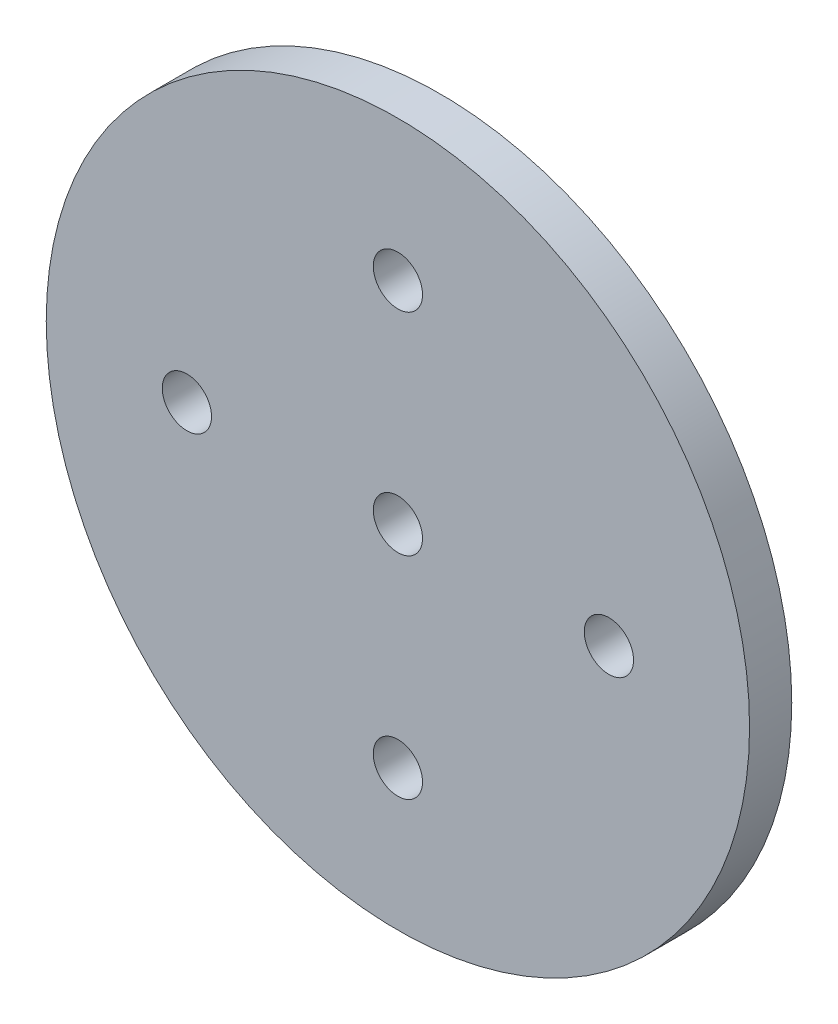
ISO-10303-21;
HEADER;
FILE_DESCRIPTION(('STEP AP214'),'2;1');
FILE_NAME('part.step','',(''),(''),'','','');
FILE_SCHEMA(('AUTOMOTIVE_DESIGN { 1 0 10303 214 1 1 1 1 }'));
ENDSEC;
DATA;
#1=APPLICATION_CONTEXT('core data for automotive mechanical design processes');
#2=APPLICATION_PROTOCOL_DEFINITION('international standard','automotive_design',2000,#1);
#3=PRODUCT_CONTEXT('',#1,'mechanical');
#4=PRODUCT('Part','Part','',(#3));
#5=PRODUCT_RELATED_PRODUCT_CATEGORY('part','',(#4));
#6=PRODUCT_DEFINITION_FORMATION('','',#4);
#7=PRODUCT_DEFINITION_CONTEXT('part definition',#1,'design');
#8=PRODUCT_DEFINITION('design','',#6,#7);
#9=PRODUCT_DEFINITION_SHAPE('','',#8);
#10=(LENGTH_UNIT() NAMED_UNIT(*) SI_UNIT(.MILLI.,.METRE.));
#11=(NAMED_UNIT(*) PLANE_ANGLE_UNIT() SI_UNIT($,.RADIAN.));
#12=(NAMED_UNIT(*) SI_UNIT($,.STERADIAN.) SOLID_ANGLE_UNIT());
#13=UNCERTAINTY_MEASURE_WITH_UNIT(LENGTH_MEASURE(1.E-05),#10,'distance_accuracy_value','');
#14=(GEOMETRIC_REPRESENTATION_CONTEXT(3) GLOBAL_UNCERTAINTY_ASSIGNED_CONTEXT((#13)) GLOBAL_UNIT_ASSIGNED_CONTEXT((#10,
#11,#12)) REPRESENTATION_CONTEXT('',''));
#15=CARTESIAN_POINT('',(0.,0.,0.));
#16=DIRECTION('',(0.,0.,1.));
#17=DIRECTION('',(1.,0.,0.));
#18=AXIS2_PLACEMENT_3D('',#15,#16,#17);
#19=CARTESIAN_POINT('',(0.,0.,3.));
#20=DIRECTION('',(0.,0.,1.));
#21=DIRECTION('',(1.,0.,0.));
#22=AXIS2_PLACEMENT_3D('',#19,#20,#21);
#23=PLANE('',#22);
#24=CARTESIAN_POINT('',(0.,-15.,3.));
#25=DIRECTION('',(0.,0.,1.));
#26=DIRECTION('',(1.,0.,0.));
#27=AXIS2_PLACEMENT_3D('',#24,#25,#26);
#28=CIRCLE('',#27,1.75);
#29=CARTESIAN_POINT('',(1.75,-15.,3.));
#30=VERTEX_POINT('',#29);
#31=EDGE_CURVE('E57',#30,#30,#28,.T.);
#32=ORIENTED_EDGE('',*,*,#31,.F.);
#33=EDGE_LOOP('',(#32));
#34=FACE_BOUND('',#33,.T.);
#35=CARTESIAN_POINT('',(0.,15.,3.));
#36=DIRECTION('',(0.,0.,1.));
#37=DIRECTION('',(1.,0.,0.));
#38=AXIS2_PLACEMENT_3D('',#35,#36,#37);
#39=CIRCLE('',#38,1.75);
#40=CARTESIAN_POINT('',(1.75,15.,3.));
#41=VERTEX_POINT('',#40);
#42=EDGE_CURVE('E45',#41,#41,#39,.T.);
#43=ORIENTED_EDGE('',*,*,#42,.F.);
#44=EDGE_LOOP('',(#43));
#45=FACE_BOUND('',#44,.T.);
#46=CARTESIAN_POINT('',(0.,0.,3.));
#47=DIRECTION('',(0.,0.,1.));
#48=DIRECTION('',(1.,0.,0.));
#49=AXIS2_PLACEMENT_3D('',#46,#47,#48);
#50=CIRCLE('',#49,25.);
#51=CARTESIAN_POINT('',(25.,0.,3.));
#52=VERTEX_POINT('',#51);
#53=EDGE_CURVE('E10',#52,#52,#50,.T.);
#54=ORIENTED_EDGE('',*,*,#53,.T.);
#55=EDGE_LOOP('',(#54));
#56=FACE_BOUND('',#55,.T.);
#57=CARTESIAN_POINT('',(0.,0.,3.));
#58=DIRECTION('',(0.,0.,1.));
#59=DIRECTION('',(1.,0.,0.));
#60=AXIS2_PLACEMENT_3D('',#57,#58,#59);
#61=CIRCLE('',#60,1.75);
#62=CARTESIAN_POINT('',(1.75,0.,3.));
#63=VERTEX_POINT('',#62);
#64=EDGE_CURVE('E40',#63,#63,#61,.T.);
#65=ORIENTED_EDGE('',*,*,#64,.F.);
#66=EDGE_LOOP('',(#65));
#67=FACE_BOUND('',#66,.T.);
#68=CARTESIAN_POINT('',(15.,0.,3.));
#69=DIRECTION('',(0.,0.,1.));
#70=DIRECTION('',(1.,0.,0.));
#71=AXIS2_PLACEMENT_3D('',#68,#69,#70);
#72=CIRCLE('',#71,1.75);
#73=CARTESIAN_POINT('',(16.75,0.,3.));
#74=VERTEX_POINT('',#73);
#75=EDGE_CURVE('E51',#74,#74,#72,.T.);
#76=ORIENTED_EDGE('',*,*,#75,.F.);
#77=EDGE_LOOP('',(#76));
#78=FACE_BOUND('',#77,.T.);
#79=CARTESIAN_POINT('',(-15.,0.,3.));
#80=DIRECTION('',(0.,0.,1.));
#81=DIRECTION('',(1.,0.,0.));
#82=AXIS2_PLACEMENT_3D('',#79,#80,#81);
#83=CIRCLE('',#82,1.75);
#84=CARTESIAN_POINT('',(-13.25,0.,3.));
#85=VERTEX_POINT('',#84);
#86=EDGE_CURVE('E63',#85,#85,#83,.T.);
#87=ORIENTED_EDGE('',*,*,#86,.F.);
#88=EDGE_LOOP('',(#87));
#89=FACE_BOUND('',#88,.T.);
#90=ADVANCED_FACE('F29',(#34,#45,#56,#67,#78,#89),#23,.T.);
#91=CARTESIAN_POINT('',(0.,0.,0.));
#92=DIRECTION('',(0.,0.,1.));
#93=DIRECTION('',(1.,0.,0.));
#94=AXIS2_PLACEMENT_3D('',#91,#92,#93);
#95=PLANE('',#94);
#96=CARTESIAN_POINT('',(0.,-15.,0.));
#97=DIRECTION('',(0.,0.,1.));
#98=DIRECTION('',(1.,0.,0.));
#99=AXIS2_PLACEMENT_3D('',#96,#97,#98);
#100=CIRCLE('',#99,1.75);
#101=CARTESIAN_POINT('',(1.75,-15.,0.));
#102=VERTEX_POINT('',#101);
#103=EDGE_CURVE('E60',#102,#102,#100,.T.);
#104=ORIENTED_EDGE('',*,*,#103,.T.);
#105=EDGE_LOOP('',(#104));
#106=FACE_BOUND('',#105,.T.);
#107=CARTESIAN_POINT('',(0.,15.,0.));
#108=DIRECTION('',(0.,0.,1.));
#109=DIRECTION('',(1.,0.,0.));
#110=AXIS2_PLACEMENT_3D('',#107,#108,#109);
#111=CIRCLE('',#110,1.75);
#112=CARTESIAN_POINT('',(1.75,15.,0.));
#113=VERTEX_POINT('',#112);
#114=EDGE_CURVE('E48',#113,#113,#111,.T.);
#115=ORIENTED_EDGE('',*,*,#114,.T.);
#116=EDGE_LOOP('',(#115));
#117=FACE_BOUND('',#116,.T.);
#118=CARTESIAN_POINT('',(0.,0.,0.));
#119=DIRECTION('',(0.,0.,1.));
#120=DIRECTION('',(1.,0.,0.));
#121=AXIS2_PLACEMENT_3D('',#118,#119,#120);
#122=CIRCLE('',#121,25.);
#123=CARTESIAN_POINT('',(25.,0.,0.));
#124=VERTEX_POINT('',#123);
#125=EDGE_CURVE('E33',#124,#124,#122,.T.);
#126=ORIENTED_EDGE('',*,*,#125,.F.);
#127=EDGE_LOOP('',(#126));
#128=FACE_BOUND('',#127,.T.);
#129=CARTESIAN_POINT('',(0.,0.,0.));
#130=DIRECTION('',(0.,0.,1.));
#131=DIRECTION('',(1.,0.,0.));
#132=AXIS2_PLACEMENT_3D('',#129,#130,#131);
#133=CIRCLE('',#132,1.75);
#134=CARTESIAN_POINT('',(1.75,0.,0.));
#135=VERTEX_POINT('',#134);
#136=EDGE_CURVE('E42',#135,#135,#133,.T.);
#137=ORIENTED_EDGE('',*,*,#136,.T.);
#138=EDGE_LOOP('',(#137));
#139=FACE_BOUND('',#138,.T.);
#140=CARTESIAN_POINT('',(15.,0.,0.));
#141=DIRECTION('',(0.,0.,1.));
#142=DIRECTION('',(1.,0.,0.));
#143=AXIS2_PLACEMENT_3D('',#140,#141,#142);
#144=CIRCLE('',#143,1.75);
#145=CARTESIAN_POINT('',(16.75,0.,0.));
#146=VERTEX_POINT('',#145);
#147=EDGE_CURVE('E54',#146,#146,#144,.T.);
#148=ORIENTED_EDGE('',*,*,#147,.T.);
#149=EDGE_LOOP('',(#148));
#150=FACE_BOUND('',#149,.T.);
#151=CARTESIAN_POINT('',(-15.,0.,0.));
#152=DIRECTION('',(0.,0.,1.));
#153=DIRECTION('',(1.,0.,0.));
#154=AXIS2_PLACEMENT_3D('',#151,#152,#153);
#155=CIRCLE('',#154,1.75);
#156=CARTESIAN_POINT('',(-13.25,0.,0.));
#157=VERTEX_POINT('',#156);
#158=EDGE_CURVE('E66',#157,#157,#155,.T.);
#159=ORIENTED_EDGE('',*,*,#158,.T.);
#160=EDGE_LOOP('',(#159));
#161=FACE_BOUND('',#160,.T.);
#162=ADVANCED_FACE('F76',(#106,#117,#128,#139,#150,#161),#95,.F.);
#163=CARTESIAN_POINT('',(0.,0.,3.));
#164=DIRECTION('',(0.,0.,-1.));
#165=DIRECTION('',(-1.,0.,0.));
#166=AXIS2_PLACEMENT_3D('',#163,#164,#165);
#167=CYLINDRICAL_SURFACE('',#166,25.);
#168=ORIENTED_EDGE('',*,*,#53,.F.);
#169=EDGE_LOOP('',(#168));
#170=FACE_BOUND('',#169,.T.);
#171=ORIENTED_EDGE('',*,*,#125,.T.);
#172=EDGE_LOOP('',(#171));
#173=FACE_BOUND('',#172,.T.);
#174=ADVANCED_FACE('F31',(#170,#173),#167,.T.);
#175=CARTESIAN_POINT('',(0.,0.,3.));
#176=DIRECTION('',(0.,0.,-1.));
#177=DIRECTION('',(-1.,0.,0.));
#178=AXIS2_PLACEMENT_3D('',#175,#176,#177);
#179=CYLINDRICAL_SURFACE('',#178,1.75);
#180=ORIENTED_EDGE('',*,*,#64,.T.);
#181=EDGE_LOOP('',(#180));
#182=FACE_BOUND('',#181,.T.);
#183=ORIENTED_EDGE('',*,*,#136,.F.);
#184=EDGE_LOOP('',(#183));
#185=FACE_BOUND('',#184,.T.);
#186=ADVANCED_FACE('F86',(#182,#185),#179,.F.);
#187=CARTESIAN_POINT('',(0.,15.,3.));
#188=DIRECTION('',(0.,0.,-1.));
#189=DIRECTION('',(-1.,0.,0.));
#190=AXIS2_PLACEMENT_3D('',#187,#188,#189);
#191=CYLINDRICAL_SURFACE('',#190,1.75);
#192=ORIENTED_EDGE('',*,*,#42,.T.);
#193=EDGE_LOOP('',(#192));
#194=FACE_BOUND('',#193,.T.);
#195=ORIENTED_EDGE('',*,*,#114,.F.);
#196=EDGE_LOOP('',(#195));
#197=FACE_BOUND('',#196,.T.);
#198=ADVANCED_FACE('F89',(#194,#197),#191,.F.);
#199=CARTESIAN_POINT('',(15.,0.,3.));
#200=DIRECTION('',(0.,0.,-1.));
#201=DIRECTION('',(-1.,0.,0.));
#202=AXIS2_PLACEMENT_3D('',#199,#200,#201);
#203=CYLINDRICAL_SURFACE('',#202,1.75);
#204=ORIENTED_EDGE('',*,*,#75,.T.);
#205=EDGE_LOOP('',(#204));
#206=FACE_BOUND('',#205,.T.);
#207=ORIENTED_EDGE('',*,*,#147,.F.);
#208=EDGE_LOOP('',(#207));
#209=FACE_BOUND('',#208,.T.);
#210=ADVANCED_FACE('F93',(#206,#209),#203,.F.);
#211=CARTESIAN_POINT('',(0.,-15.,3.));
#212=DIRECTION('',(0.,0.,-1.));
#213=DIRECTION('',(-1.,0.,0.));
#214=AXIS2_PLACEMENT_3D('',#211,#212,#213);
#215=CYLINDRICAL_SURFACE('',#214,1.75);
#216=ORIENTED_EDGE('',*,*,#31,.T.);
#217=EDGE_LOOP('',(#216));
#218=FACE_BOUND('',#217,.T.);
#219=ORIENTED_EDGE('',*,*,#103,.F.);
#220=EDGE_LOOP('',(#219));
#221=FACE_BOUND('',#220,.T.);
#222=ADVANCED_FACE('F97',(#218,#221),#215,.F.);
#223=CARTESIAN_POINT('',(-15.,0.,3.));
#224=DIRECTION('',(0.,0.,-1.));
#225=DIRECTION('',(-1.,0.,0.));
#226=AXIS2_PLACEMENT_3D('',#223,#224,#225);
#227=CYLINDRICAL_SURFACE('',#226,1.75);
#228=ORIENTED_EDGE('',*,*,#86,.T.);
#229=EDGE_LOOP('',(#228));
#230=FACE_BOUND('',#229,.T.);
#231=ORIENTED_EDGE('',*,*,#158,.F.);
#232=EDGE_LOOP('',(#231));
#233=FACE_BOUND('',#232,.T.);
#234=ADVANCED_FACE('F72',(#230,#233),#227,.F.);
#235=CLOSED_SHELL('',(#90,#162,#174,#186,#198,#210,#222,#234));
#236=MANIFOLD_SOLID_BREP('B2',#235);
#237=ADVANCED_BREP_SHAPE_REPRESENTATION('',(#18,#236),#14);
#238=SHAPE_DEFINITION_REPRESENTATION(#9,#237);
ENDSEC;
END-ISO-10303-21;
